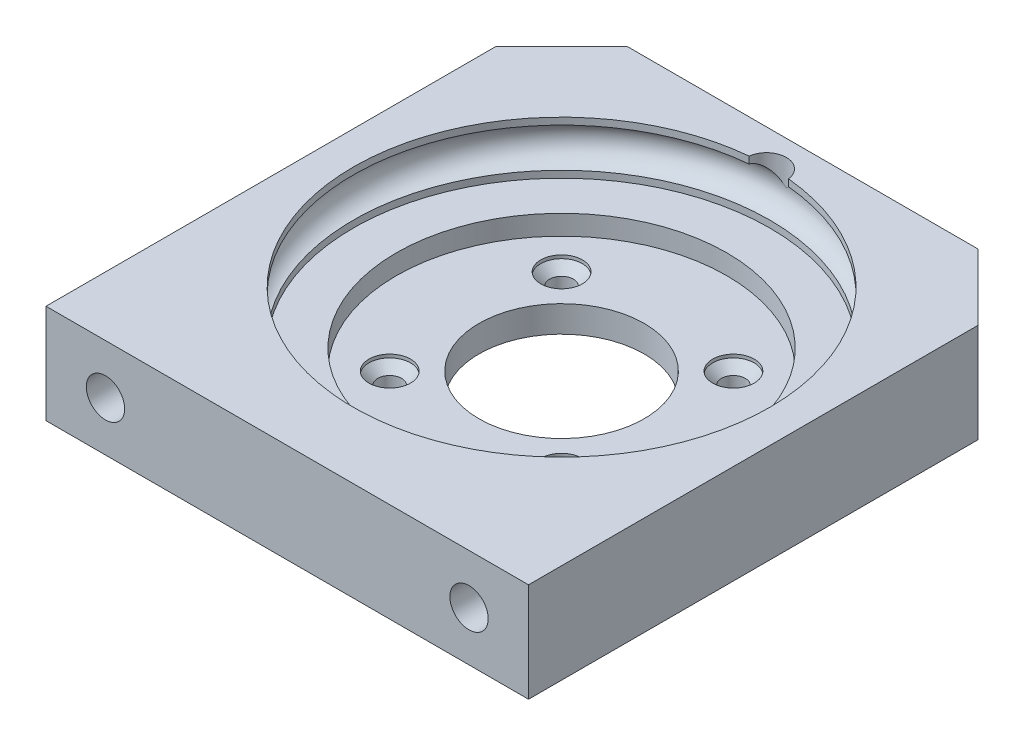
ISO-10303-21;
HEADER;
FILE_DESCRIPTION(('STEP AP214'),'2;1');
FILE_NAME('part.step','',(''),(''),'','','');
FILE_SCHEMA(('AUTOMOTIVE_DESIGN { 1 0 10303 214 1 1 1 1 }'));
ENDSEC;
DATA;
#1=APPLICATION_CONTEXT('core data for automotive mechanical design processes');
#2=APPLICATION_PROTOCOL_DEFINITION('international standard','automotive_design',2000,#1);
#3=PRODUCT_CONTEXT('',#1,'mechanical');
#4=PRODUCT('Part','Part','',(#3));
#5=PRODUCT_RELATED_PRODUCT_CATEGORY('part','',(#4));
#6=PRODUCT_DEFINITION_FORMATION('','',#4);
#7=PRODUCT_DEFINITION_CONTEXT('part definition',#1,'design');
#8=PRODUCT_DEFINITION('design','',#6,#7);
#9=PRODUCT_DEFINITION_SHAPE('','',#8);
#10=(LENGTH_UNIT() NAMED_UNIT(*) SI_UNIT(.MILLI.,.METRE.));
#11=(NAMED_UNIT(*) PLANE_ANGLE_UNIT() SI_UNIT($,.RADIAN.));
#12=(NAMED_UNIT(*) SI_UNIT($,.STERADIAN.) SOLID_ANGLE_UNIT());
#13=UNCERTAINTY_MEASURE_WITH_UNIT(LENGTH_MEASURE(1.E-05),#10,'distance_accuracy_value','');
#14=(GEOMETRIC_REPRESENTATION_CONTEXT(3) GLOBAL_UNCERTAINTY_ASSIGNED_CONTEXT((#13)) GLOBAL_UNIT_ASSIGNED_CONTEXT((#10,
#11,#12)) REPRESENTATION_CONTEXT('',''));
#15=CARTESIAN_POINT('',(0.,0.,0.));
#16=DIRECTION('',(0.,0.,1.));
#17=DIRECTION('',(1.,0.,0.));
#18=AXIS2_PLACEMENT_3D('',#15,#16,#17);
#19=CARTESIAN_POINT('',(0.,0.,0.));
#20=DIRECTION('',(0.,-1.,0.));
#21=DIRECTION('',(0.,0.,-1.));
#22=AXIS2_PLACEMENT_3D('',#19,#20,#21);
#23=CYLINDRICAL_SURFACE('',#22,31.5);
#24=DIRECTION('',(0.,-1.,0.));
#25=VECTOR('',#24,1.);
#26=CARTESIAN_POINT('',(2.97845792794056,12.,-31.3588709677419));
#27=LINE('',#26,#25);
#28=CARTESIAN_POINT('',(2.97845792794056,9.95803989154981,-31.3588709677419));
#29=VERTEX_POINT('',#28);
#30=CARTESIAN_POINT('',(2.97845792794056,11.,-31.3588709677419));
#31=VERTEX_POINT('',#30);
#32=EDGE_CURVE('E84',#29,#31,#27,.F.);
#33=ORIENTED_EDGE('',*,*,#32,.F.);
#34=CARTESIAN_POINT('',(0.,9.95803989154981,0.));
#35=DIRECTION('',(0.,-1.,0.));
#36=DIRECTION('',(0.,0.,-1.));
#37=AXIS2_PLACEMENT_3D('',#34,#35,#36);
#38=CIRCLE('',#37,31.5);
#39=CARTESIAN_POINT('',(-2.97845792794059,9.95803989154985,-31.3588709677417));
#40=VERTEX_POINT('',#39);
#41=EDGE_CURVE('E256',#40,#29,#38,.F.);
#42=ORIENTED_EDGE('',*,*,#41,.F.);
#43=DIRECTION('',(0.,-1.,0.));
#44=VECTOR('',#43,1.);
#45=CARTESIAN_POINT('',(-2.97845792794056,12.,-31.3588709677419));
#46=LINE('',#45,#44);
#47=CARTESIAN_POINT('',(-2.97845792794057,11.,-31.3588709677419));
#48=VERTEX_POINT('',#47);
#49=EDGE_CURVE('E246',#48,#40,#46,.T.);
#50=ORIENTED_EDGE('',*,*,#49,.F.);
#51=CARTESIAN_POINT('',(0.,11.,0.));
#52=DIRECTION('',(0.,-1.,0.));
#53=DIRECTION('',(0.,0.,-1.));
#54=AXIS2_PLACEMENT_3D('',#51,#52,#53);
#55=CIRCLE('',#54,31.5);
#56=EDGE_CURVE('E255',#31,#48,#55,.T.);
#57=ORIENTED_EDGE('',*,*,#56,.F.);
#58=EDGE_LOOP('',(#33,#42,#50,#57));
#59=FACE_BOUND('',#58,.T.);
#60=ADVANCED_FACE('F59',(#59),#23,.F.);
#61=CARTESIAN_POINT('',(0.,7.,0.));
#62=DIRECTION('',(0.,1.,0.));
#63=DIRECTION('',(0.,0.,1.));
#64=AXIS2_PLACEMENT_3D('',#61,#62,#63);
#65=TOROIDAL_SURFACE('',#64,31.,3.);
#66=CARTESIAN_POINT('',(0.,4.04196010845019,0.));
#67=DIRECTION('',(0.,1.,0.));
#68=DIRECTION('',(0.,0.,1.));
#69=AXIS2_PLACEMENT_3D('',#66,#67,#68);
#70=CIRCLE('',#69,31.5);
#71=CARTESIAN_POINT('',(0.,4.04196010845019,31.5));
#72=VERTEX_POINT('',#71);
#73=EDGE_CURVE('E251',#72,#72,#70,.F.);
#74=ORIENTED_EDGE('',*,*,#73,.T.);
#75=EDGE_LOOP('',(#74));
#76=FACE_BOUND('',#75,.T.);
#77=CARTESIAN_POINT('',(2.97860271892137,9.95823989154962,-31.3576672235951));
#78=CARTESIAN_POINT('',(2.96961319538511,9.94580815796942,-31.4326612954091));
#79=CARTESIAN_POINT('',(2.95781984500975,9.93069112648078,-31.5068265589619));
#80=CARTESIAN_POINT('',(2.92904327671696,9.89556756812398,-31.6528469616678));
#81=CARTESIAN_POINT('',(2.91206774191171,9.87556828841667,-31.7247053478591));
#82=CARTESIAN_POINT('',(2.87350186212874,9.83133545555906,-31.8650067964754));
#83=CARTESIAN_POINT('',(2.85195741896618,9.80714442744418,-31.9334760380271));
#84=CARTESIAN_POINT('',(2.80459274499494,9.75486552097224,-32.0673838385704));
#85=CARTESIAN_POINT('',(2.77877097644328,9.72677624174456,-32.132821296738));
#86=CARTESIAN_POINT('',(2.69587281937994,9.63770358228518,-32.3233887363522));
#87=CARTESIAN_POINT('',(2.63309368495355,9.57160690276578,-32.4437205284455));
#88=CARTESIAN_POINT('',(2.49536513058079,9.42883664525896,-32.6705868738374));
#89=CARTESIAN_POINT('',(2.42038123113751,9.35213319739032,-32.7770807546173));
#90=CARTESIAN_POINT('',(2.2186475967732,9.1479449392115,-33.0286994375676));
#91=CARTESIAN_POINT('',(2.08552089026227,9.01508753824053,-33.1643953651653));
#92=CARTESIAN_POINT('',(1.80418814678327,8.73718027948922,-33.4039921001392));
#93=CARTESIAN_POINT('',(1.65594939594703,8.59210409423334,-33.5078218909128));
#94=CARTESIAN_POINT('',(1.30250196492393,8.24845599376992,-33.7123807801422));
#95=CARTESIAN_POINT('',(1.09376903077063,8.04712807205924,-33.8023835834338));
#96=CARTESIAN_POINT('',(0.668072251464688,7.63832921215929,-33.9331125173233));
#97=CARTESIAN_POINT('',(0.451123531311858,7.43086970321803,-33.9739250525231));
#98=CARTESIAN_POINT('',(0.15839588872738,7.15124751721302,-33.9967571002609));
#99=CARTESIAN_POINT('',(0.0833492871382182,7.07958724633899,-33.9997809584472));
#100=CARTESIAN_POINT('',(0.0055314779359947,7.00528180752916,-33.9999961750689));
#101=CARTESIAN_POINT('',(0.00276574036243576,7.00264090508273,-33.9999999996302));
#102=CARTESIAN_POINT('',(0.,7.,-34.));
#103=B_SPLINE_CURVE_WITH_KNOTS('',3,(#77,#78,#79,#80,#81,#82,#83,#84,#85,#86,#87,#88,#89,#90,
#91,#92,#93,#94,#95,#96,#97,#98,#99,#100,#101,#102),.UNSPECIFIED.,.F.,.F.,(4,2,2,2,2,2,2,2,2,2,
2,2,4),(0.,0.229471447735022,0.458604319690245,0.685535884959593,0.912549212260038,
1.36351867841234,1.81578501916203,2.50768630929996,3.20111855163623,4.10731547292602,
5.01191829368785,5.32323496449337,5.33470723693077),.UNSPECIFIED.);
#104=CARTESIAN_POINT('',(0.,7.,-34.));
#105=VERTEX_POINT('',#104);
#106=EDGE_CURVE('E73',#29,#105,#103,.T.);
#107=ORIENTED_EDGE('',*,*,#106,.T.);
#108=CARTESIAN_POINT('',(0.,7.,-34.));
#109=CARTESIAN_POINT('',(-0.002765647860512,7.00264081668702,-34.0000000011512));
#110=CARTESIAN_POINT('',(-0.00553138660048125,7.00528172024243,-33.9999961767244));
#111=CARTESIAN_POINT('',(-0.23464124815582,7.22405052621168,-33.9993624234132));
#112=CARTESIAN_POINT('',(-0.461539385494061,7.44071660879585,-33.973111273688));
#113=CARTESIAN_POINT('',(-0.796409689426835,7.76155236974791,-33.89464314795));
#114=CARTESIAN_POINT('',(-0.907306746938084,7.8679836102798,-33.861881456631));
#115=CARTESIAN_POINT('',(-1.12631166996082,8.07871570513723,-33.7829742681646));
#116=CARTESIAN_POINT('',(-1.23442082309198,8.18301753813848,-33.7368350746216));
#117=CARTESIAN_POINT('',(-1.50062536791018,8.44078143318314,-33.6038737713653));
#118=CARTESIAN_POINT('',(-1.65627960865482,8.59236196190765,-33.5082849273703));
#119=CARTESIAN_POINT('',(-1.95369746867632,8.88442459343492,-33.2842160575573));
#120=CARTESIAN_POINT('',(-2.09548146070192,9.02492291325072,-33.1557853044252));
#121=CARTESIAN_POINT('',(-2.32460934254051,9.25485851140415,-32.9019630596168));
#122=CARTESIAN_POINT('',(-2.41658632367543,9.34814636700671,-32.7842503508661));
#123=CARTESIAN_POINT('',(-2.58505712644061,9.52138642029013,-32.52989565695));
#124=CARTESIAN_POINT('',(-2.66160982974674,9.60138911960184,-32.3933291470279));
#125=CARTESIAN_POINT('',(-2.75881008738837,9.70520608764476,-32.1808565423279));
#126=CARTESIAN_POINT('',(-2.78736085797565,9.73607532256737,-32.1118957326226));
#127=CARTESIAN_POINT('',(-2.83969690867676,9.79348493503032,-31.9704637216388));
#128=CARTESIAN_POINT('',(-2.86348454641178,9.82002745296235,-31.8979942792067));
#129=CARTESIAN_POINT('',(-2.90601536881001,9.86850267568364,-31.7490853466569));
#130=CARTESIAN_POINT('',(-2.92469760738888,9.89037905439563,-31.6726098721228));
#131=CARTESIAN_POINT('',(-2.95619584400745,9.92861274432593,-31.5169666725388));
#132=CARTESIAN_POINT('',(-2.96900092172859,9.94495976678048,-31.4377942270065));
#133=CARTESIAN_POINT('',(-2.97860271892137,9.95823989154963,-31.3576672235951));
#134=B_SPLINE_CURVE_WITH_KNOTS('',3,(#108,#109,#110,#111,#112,#113,#114,#115,#116,#117,#118,
#119,#120,#121,#122,#123,#124,#125,#126,#127,#128,#129,#130,#131,#132,#133),.UNSPECIFIED.,.F.,
.F.,(4,2,2,2,2,2,2,2,2,2,2,2,4),(0.,0.0114722724373894,0.950318295086905,1.42136837522893,
1.89219685189768,2.60169449687052,3.31013386528673,3.83676155840078,4.36133910101925,
4.60337668360134,4.8452941663969,5.08998456815068,5.33512780519066),.UNSPECIFIED.);
#135=EDGE_CURVE('E12',#105,#40,#134,.T.);
#136=ORIENTED_EDGE('',*,*,#135,.T.);
#137=ORIENTED_EDGE('',*,*,#41,.T.);
#138=EDGE_LOOP('',(#107,#136,#137));
#139=FACE_BOUND('',#138,.T.);
#140=ADVANCED_FACE('F278',(#76,#139),#65,.F.);
#141=CARTESIAN_POINT('',(0.,3.,0.));
#142=DIRECTION('',(0.,-1.,0.));
#143=DIRECTION('',(0.,0.,-1.));
#144=AXIS2_PLACEMENT_3D('',#141,#142,#143);
#145=CIRCLE('',#144,31.5);
#146=CARTESIAN_POINT('',(0.,3.,-31.5));
#147=VERTEX_POINT('',#146);
#148=EDGE_CURVE('E252',#147,#147,#145,.T.);
#149=ORIENTED_EDGE('',*,*,#148,.T.);
#150=EDGE_LOOP('',(#149));
#151=FACE_BOUND('',#150,.T.);
#152=ORIENTED_EDGE('',*,*,#73,.F.);
#153=EDGE_LOOP('',(#152));
#154=FACE_BOUND('',#153,.T.);
#155=ADVANCED_FACE('F374',(#151,#154),#23,.F.);
#156=CARTESIAN_POINT('',(-25.,3.,0.));
#157=DIRECTION('',(0.,-1.,0.));
#158=DIRECTION('',(0.,0.,-1.));
#159=AXIS2_PLACEMENT_3D('',#156,#157,#158);
#160=PLANE('',#159);
#161=ORIENTED_EDGE('',*,*,#148,.F.);
#162=EDGE_LOOP('',(#161));
#163=FACE_BOUND('',#162,.T.);
#164=CARTESIAN_POINT('',(0.,3.,0.));
#165=DIRECTION('',(0.,-1.,0.));
#166=DIRECTION('',(0.,0.,-1.));
#167=AXIS2_PLACEMENT_3D('',#164,#165,#166);
#168=CIRCLE('',#167,25.);
#169=CARTESIAN_POINT('',(0.,3.,-25.));
#170=VERTEX_POINT('',#169);
#171=EDGE_CURVE('E268',#170,#170,#168,.T.);
#172=ORIENTED_EDGE('',*,*,#171,.T.);
#173=EDGE_LOOP('',(#172));
#174=FACE_BOUND('',#173,.T.);
#175=ADVANCED_FACE('F61',(#163,#174),#160,.F.);
#176=CARTESIAN_POINT('',(0.,0.,0.));
#177=DIRECTION('',(0.,-1.,0.));
#178=DIRECTION('',(0.,0.,-1.));
#179=AXIS2_PLACEMENT_3D('',#176,#177,#178);
#180=CYLINDRICAL_SURFACE('',#179,25.);
#181=ORIENTED_EDGE('',*,*,#171,.F.);
#182=EDGE_LOOP('',(#181));
#183=FACE_BOUND('',#182,.T.);
#184=CARTESIAN_POINT('',(0.,0.,0.));
#185=DIRECTION('',(0.,-1.,0.));
#186=DIRECTION('',(0.,0.,-1.));
#187=AXIS2_PLACEMENT_3D('',#184,#185,#186);
#188=CIRCLE('',#187,25.);
#189=CARTESIAN_POINT('',(0.,0.,-25.));
#190=VERTEX_POINT('',#189);
#191=EDGE_CURVE('E265',#190,#190,#188,.T.);
#192=ORIENTED_EDGE('',*,*,#191,.T.);
#193=EDGE_LOOP('',(#192));
#194=FACE_BOUND('',#193,.T.);
#195=ADVANCED_FACE('F385',(#183,#194),#180,.F.);
#196=CARTESIAN_POINT('',(-25.,0.,0.));
#197=DIRECTION('',(0.,-1.,0.));
#198=DIRECTION('',(0.,0.,-1.));
#199=AXIS2_PLACEMENT_3D('',#196,#197,#198);
#200=PLANE('',#199);
#201=CARTESIAN_POINT('',(13.,0.,-13.));
#202=DIRECTION('',(0.,1.,0.));
#203=DIRECTION('',(0.,0.,1.));
#204=AXIS2_PLACEMENT_3D('',#201,#202,#203);
#205=CIRCLE('',#204,3.15);
#206=CARTESIAN_POINT('',(13.,0.,-9.85));
#207=VERTEX_POINT('',#206);
#208=EDGE_CURVE('E140',#207,#207,#205,.T.);
#209=ORIENTED_EDGE('',*,*,#208,.F.);
#210=EDGE_LOOP('',(#209));
#211=FACE_BOUND('',#210,.T.);
#212=CARTESIAN_POINT('',(13.,0.,13.));
#213=DIRECTION('',(0.,1.,0.));
#214=DIRECTION('',(0.,0.,1.));
#215=AXIS2_PLACEMENT_3D('',#212,#213,#214);
#216=CIRCLE('',#215,3.15);
#217=CARTESIAN_POINT('',(13.,0.,16.15));
#218=VERTEX_POINT('',#217);
#219=EDGE_CURVE('E180',#218,#218,#216,.T.);
#220=ORIENTED_EDGE('',*,*,#219,.F.);
#221=EDGE_LOOP('',(#220));
#222=FACE_BOUND('',#221,.T.);
#223=CARTESIAN_POINT('',(-13.,0.,13.));
#224=DIRECTION('',(0.,1.,0.));
#225=DIRECTION('',(0.,0.,1.));
#226=AXIS2_PLACEMENT_3D('',#223,#224,#225);
#227=CIRCLE('',#226,3.15);
#228=CARTESIAN_POINT('',(-13.,0.,16.15));
#229=VERTEX_POINT('',#228);
#230=EDGE_CURVE('E192',#229,#229,#227,.T.);
#231=ORIENTED_EDGE('',*,*,#230,.F.);
#232=EDGE_LOOP('',(#231));
#233=FACE_BOUND('',#232,.T.);
#234=CARTESIAN_POINT('',(-13.,0.,-13.));
#235=DIRECTION('',(0.,1.,0.));
#236=DIRECTION('',(0.,0.,1.));
#237=AXIS2_PLACEMENT_3D('',#234,#235,#236);
#238=CIRCLE('',#237,3.15);
#239=CARTESIAN_POINT('',(-13.,0.,-9.85));
#240=VERTEX_POINT('',#239);
#241=EDGE_CURVE('E204',#240,#240,#238,.T.);
#242=ORIENTED_EDGE('',*,*,#241,.F.);
#243=EDGE_LOOP('',(#242));
#244=FACE_BOUND('',#243,.T.);
#245=ORIENTED_EDGE('',*,*,#191,.F.);
#246=EDGE_LOOP('',(#245));
#247=FACE_BOUND('',#246,.T.);
#248=CARTESIAN_POINT('',(0.,0.,0.));
#249=DIRECTION('',(0.,-1.,0.));
#250=DIRECTION('',(0.,0.,-1.));
#251=AXIS2_PLACEMENT_3D('',#248,#249,#250);
#252=CIRCLE('',#251,12.5);
#253=CARTESIAN_POINT('',(0.,0.,-12.5));
#254=VERTEX_POINT('',#253);
#255=EDGE_CURVE('E262',#254,#254,#252,.T.);
#256=ORIENTED_EDGE('',*,*,#255,.T.);
#257=EDGE_LOOP('',(#256));
#258=FACE_BOUND('',#257,.T.);
#259=ADVANCED_FACE('F415',(#211,#222,#233,#244,#247,#258),#200,.F.);
#260=CARTESIAN_POINT('',(0.,0.,0.));
#261=DIRECTION('',(0.,-1.,0.));
#262=DIRECTION('',(0.,0.,-1.));
#263=AXIS2_PLACEMENT_3D('',#260,#261,#262);
#264=CYLINDRICAL_SURFACE('',#263,12.5);
#265=ORIENTED_EDGE('',*,*,#255,.F.);
#266=EDGE_LOOP('',(#265));
#267=FACE_BOUND('',#266,.T.);
#268=CARTESIAN_POINT('',(0.,-4.,0.));
#269=DIRECTION('',(0.,-1.,0.));
#270=DIRECTION('',(0.,0.,-1.));
#271=AXIS2_PLACEMENT_3D('',#268,#269,#270);
#272=CIRCLE('',#271,12.5);
#273=CARTESIAN_POINT('',(0.,-4.,-12.5));
#274=VERTEX_POINT('',#273);
#275=EDGE_CURVE('E259',#274,#274,#272,.T.);
#276=ORIENTED_EDGE('',*,*,#275,.T.);
#277=EDGE_LOOP('',(#276));
#278=FACE_BOUND('',#277,.T.);
#279=ADVANCED_FACE('F409',(#267,#278),#264,.F.);
#280=CARTESIAN_POINT('',(-12.5,-4.,0.));
#281=DIRECTION('',(0.,1.,0.));
#282=DIRECTION('',(0.,0.,1.));
#283=AXIS2_PLACEMENT_3D('',#280,#281,#282);
#284=PLANE('',#283);
#285=CARTESIAN_POINT('',(13.,-4.,-13.));
#286=DIRECTION('',(0.,1.,0.));
#287=DIRECTION('',(0.,0.,1.));
#288=AXIS2_PLACEMENT_3D('',#285,#286,#287);
#289=CIRCLE('',#288,1.8);
#290=CARTESIAN_POINT('',(13.,-4.,-11.2));
#291=VERTEX_POINT('',#290);
#292=EDGE_CURVE('E177',#291,#291,#289,.T.);
#293=ORIENTED_EDGE('',*,*,#292,.T.);
#294=EDGE_LOOP('',(#293));
#295=FACE_BOUND('',#294,.T.);
#296=CARTESIAN_POINT('',(13.,-4.,13.));
#297=DIRECTION('',(0.,1.,0.));
#298=DIRECTION('',(0.,0.,1.));
#299=AXIS2_PLACEMENT_3D('',#296,#297,#298);
#300=CIRCLE('',#299,1.8);
#301=CARTESIAN_POINT('',(13.,-4.,14.8));
#302=VERTEX_POINT('',#301);
#303=EDGE_CURVE('E189',#302,#302,#300,.T.);
#304=ORIENTED_EDGE('',*,*,#303,.T.);
#305=EDGE_LOOP('',(#304));
#306=FACE_BOUND('',#305,.T.);
#307=CARTESIAN_POINT('',(-13.,-4.,13.));
#308=DIRECTION('',(0.,1.,0.));
#309=DIRECTION('',(0.,0.,1.));
#310=AXIS2_PLACEMENT_3D('',#307,#308,#309);
#311=CIRCLE('',#310,1.8);
#312=CARTESIAN_POINT('',(-13.,-4.,14.8));
#313=VERTEX_POINT('',#312);
#314=EDGE_CURVE('E201',#313,#313,#311,.T.);
#315=ORIENTED_EDGE('',*,*,#314,.T.);
#316=EDGE_LOOP('',(#315));
#317=FACE_BOUND('',#316,.T.);
#318=CARTESIAN_POINT('',(-13.,-4.,-13.));
#319=DIRECTION('',(0.,1.,0.));
#320=DIRECTION('',(0.,0.,1.));
#321=AXIS2_PLACEMENT_3D('',#318,#319,#320);
#322=CIRCLE('',#321,1.8);
#323=CARTESIAN_POINT('',(-13.,-4.,-11.2));
#324=VERTEX_POINT('',#323);
#325=EDGE_CURVE('E213',#324,#324,#322,.T.);
#326=ORIENTED_EDGE('',*,*,#325,.T.);
#327=EDGE_LOOP('',(#326));
#328=FACE_BOUND('',#327,.T.);
#329=ORIENTED_EDGE('',*,*,#275,.F.);
#330=EDGE_LOOP('',(#329));
#331=FACE_BOUND('',#330,.T.);
#332=DIRECTION('',(0.,0.,-1.));
#333=VECTOR('',#332,1.);
#334=CARTESIAN_POINT('',(-36.5,-4.,0.));
#335=LINE('',#334,#333);
#336=CARTESIAN_POINT('',(-36.5,-4.,41.5));
#337=VERTEX_POINT('',#336);
#338=CARTESIAN_POINT('',(-36.5,-4.,-26.5));
#339=VERTEX_POINT('',#338);
#340=EDGE_CURVE('E234',#337,#339,#335,.T.);
#341=ORIENTED_EDGE('',*,*,#340,.T.);
#342=DIRECTION('',(-0.707106781186549,0.,0.707106781186546));
#343=VECTOR('',#342,1.);
#344=CARTESIAN_POINT('',(-31.4999999999999,-4.,-31.5));
#345=LINE('',#344,#343);
#346=CARTESIAN_POINT('',(-26.5,-4.,-36.5));
#347=VERTEX_POINT('',#346);
#348=EDGE_CURVE('E136',#347,#339,#345,.T.);
#349=ORIENTED_EDGE('',*,*,#348,.F.);
#350=DIRECTION('',(-1.,0.,0.));
#351=VECTOR('',#350,1.);
#352=CARTESIAN_POINT('',(0.,-4.,-36.5));
#353=LINE('',#352,#351);
#354=CARTESIAN_POINT('',(26.4999999999999,-4.,-36.5));
#355=VERTEX_POINT('',#354);
#356=EDGE_CURVE('E130',#355,#347,#353,.T.);
#357=ORIENTED_EDGE('',*,*,#356,.F.);
#358=DIRECTION('',(0.707106781186549,0.,0.707106781186546));
#359=VECTOR('',#358,1.);
#360=CARTESIAN_POINT('',(31.4999999999999,-4.,-31.5000000000001));
#361=LINE('',#360,#359);
#362=CARTESIAN_POINT('',(36.5,-4.,-26.5));
#363=VERTEX_POINT('',#362);
#364=EDGE_CURVE('E133',#355,#363,#361,.T.);
#365=ORIENTED_EDGE('',*,*,#364,.T.);
#366=DIRECTION('',(0.,0.,1.));
#367=VECTOR('',#366,1.);
#368=CARTESIAN_POINT('',(36.5,-4.,41.5));
#369=LINE('',#368,#367);
#370=CARTESIAN_POINT('',(36.5,-4.,41.5));
#371=VERTEX_POINT('',#370);
#372=EDGE_CURVE('E231',#363,#371,#369,.T.);
#373=ORIENTED_EDGE('',*,*,#372,.T.);
#374=DIRECTION('',(-1.,0.,0.));
#375=VECTOR('',#374,1.);
#376=CARTESIAN_POINT('',(-36.5,-4.,41.5));
#377=LINE('',#376,#375);
#378=EDGE_CURVE('E229',#371,#337,#377,.T.);
#379=ORIENTED_EDGE('',*,*,#378,.T.);
#380=EDGE_LOOP('',(#341,#349,#357,#365,#373,#379));
#381=FACE_BOUND('',#380,.T.);
#382=ADVANCED_FACE('F132',(#295,#306,#317,#328,#331,#381),#284,.F.);
#383=CARTESIAN_POINT('',(-31.5,11.,0.));
#384=DIRECTION('',(0.,-1.,0.));
#385=DIRECTION('',(0.,0.,-1.));
#386=AXIS2_PLACEMENT_3D('',#383,#384,#385);
#387=PLANE('',#386);
#388=CARTESIAN_POINT('',(0.,11.,-31.));
#389=DIRECTION('',(0.,-1.,0.));
#390=DIRECTION('',(0.,0.,-1.));
#391=AXIS2_PLACEMENT_3D('',#388,#389,#390);
#392=CIRCLE('',#391,3.);
#393=EDGE_CURVE('E249',#31,#48,#392,.F.);
#394=ORIENTED_EDGE('',*,*,#393,.F.);
#395=ORIENTED_EDGE('',*,*,#56,.T.);
#396=EDGE_LOOP('',(#394,#395));
#397=FACE_BOUND('',#396,.T.);
#398=DIRECTION('',(0.,0.,-1.));
#399=VECTOR('',#398,1.);
#400=CARTESIAN_POINT('',(36.5,11.,41.5));
#401=LINE('',#400,#399);
#402=CARTESIAN_POINT('',(36.5,11.,41.5));
#403=VERTEX_POINT('',#402);
#404=CARTESIAN_POINT('',(36.5,11.,-26.5));
#405=VERTEX_POINT('',#404);
#406=EDGE_CURVE('E240',#403,#405,#401,.T.);
#407=ORIENTED_EDGE('',*,*,#406,.T.);
#408=DIRECTION('',(-0.707106781186549,0.,-0.707106781186546));
#409=VECTOR('',#408,1.);
#410=CARTESIAN_POINT('',(31.4999999999999,11.,-31.5000000000001));
#411=LINE('',#410,#409);
#412=CARTESIAN_POINT('',(26.4999999999999,11.,-36.5));
#413=VERTEX_POINT('',#412);
#414=EDGE_CURVE('E151',#405,#413,#411,.T.);
#415=ORIENTED_EDGE('',*,*,#414,.T.);
#416=DIRECTION('',(1.,0.,0.));
#417=VECTOR('',#416,1.);
#418=CARTESIAN_POINT('',(0.,11.,-36.5));
#419=LINE('',#418,#417);
#420=CARTESIAN_POINT('',(-26.5,11.,-36.5));
#421=VERTEX_POINT('',#420);
#422=EDGE_CURVE('E150',#421,#413,#419,.T.);
#423=ORIENTED_EDGE('',*,*,#422,.F.);
#424=DIRECTION('',(0.707106781186549,0.,-0.707106781186546));
#425=VECTOR('',#424,1.);
#426=CARTESIAN_POINT('',(-31.4999999999999,11.,-31.5));
#427=LINE('',#426,#425);
#428=CARTESIAN_POINT('',(-36.5,11.,-26.5));
#429=VERTEX_POINT('',#428);
#430=EDGE_CURVE('E160',#429,#421,#427,.T.);
#431=ORIENTED_EDGE('',*,*,#430,.F.);
#432=DIRECTION('',(0.,0.,1.));
#433=VECTOR('',#432,1.);
#434=CARTESIAN_POINT('',(-36.5,11.,0.));
#435=LINE('',#434,#433);
#436=CARTESIAN_POINT('',(-36.5,11.,41.5));
#437=VERTEX_POINT('',#436);
#438=EDGE_CURVE('E220',#429,#437,#435,.T.);
#439=ORIENTED_EDGE('',*,*,#438,.T.);
#440=DIRECTION('',(1.,0.,0.));
#441=VECTOR('',#440,1.);
#442=CARTESIAN_POINT('',(-36.5,11.,41.5));
#443=LINE('',#442,#441);
#444=EDGE_CURVE('E237',#437,#403,#443,.T.);
#445=ORIENTED_EDGE('',*,*,#444,.T.);
#446=EDGE_LOOP('',(#407,#415,#423,#431,#439,#445));
#447=FACE_BOUND('',#446,.T.);
#448=ADVANCED_FACE('F286',(#397,#447),#387,.F.);
#449=CARTESIAN_POINT('',(0.,17.,-31.));
#450=DIRECTION('',(0.,-1.,0.));
#451=DIRECTION('',(0.,0.,-1.));
#452=AXIS2_PLACEMENT_3D('',#449,#450,#451);
#453=CYLINDRICAL_SURFACE('',#452,3.);
#454=ORIENTED_EDGE('',*,*,#393,.T.);
#455=ORIENTED_EDGE('',*,*,#49,.T.);
#456=ORIENTED_EDGE('',*,*,#135,.F.);
#457=ORIENTED_EDGE('',*,*,#106,.F.);
#458=ORIENTED_EDGE('',*,*,#32,.T.);
#459=EDGE_LOOP('',(#454,#455,#456,#457,#458));
#460=FACE_BOUND('',#459,.T.);
#461=ADVANCED_FACE('F281',(#460),#453,.F.);
#462=CARTESIAN_POINT('',(36.5,-87.9717214304911,41.5));
#463=DIRECTION('',(1.,0.,0.));
#464=DIRECTION('',(0.,0.,-1.));
#465=AXIS2_PLACEMENT_3D('',#462,#463,#464);
#466=PLANE('',#465);
#467=ORIENTED_EDGE('',*,*,#372,.F.);
#468=DIRECTION('',(0.,1.,0.));
#469=VECTOR('',#468,1.);
#470=CARTESIAN_POINT('',(36.5,-55.618795026618,-26.5));
#471=LINE('',#470,#469);
#472=EDGE_CURVE('E149',#363,#405,#471,.T.);
#473=ORIENTED_EDGE('',*,*,#472,.T.);
#474=ORIENTED_EDGE('',*,*,#406,.F.);
#475=DIRECTION('',(0.,1.,0.));
#476=VECTOR('',#475,1.);
#477=CARTESIAN_POINT('',(36.5,-87.9717214304911,41.5));
#478=LINE('',#477,#476);
#479=EDGE_CURVE('E232',#371,#403,#478,.T.);
#480=ORIENTED_EDGE('',*,*,#479,.F.);
#481=EDGE_LOOP('',(#467,#473,#474,#480));
#482=FACE_BOUND('',#481,.T.);
#483=ADVANCED_FACE('F285',(#482),#466,.T.);
#484=CARTESIAN_POINT('',(-36.5,-87.9717214304911,41.5));
#485=DIRECTION('',(0.,0.,1.));
#486=DIRECTION('',(1.,0.,0.));
#487=AXIS2_PLACEMENT_3D('',#484,#485,#486);
#488=PLANE('',#487);
#489=CARTESIAN_POINT('',(-27.5,3.5,41.5));
#490=DIRECTION('',(0.,0.,1.));
#491=DIRECTION('',(1.,0.,0.));
#492=AXIS2_PLACEMENT_3D('',#489,#490,#491);
#493=CIRCLE('',#492,2.9);
#494=CARTESIAN_POINT('',(-24.6,3.5,41.5));
#495=VERTEX_POINT('',#494);
#496=EDGE_CURVE('E221',#495,#495,#493,.T.);
#497=ORIENTED_EDGE('',*,*,#496,.F.);
#498=EDGE_LOOP('',(#497));
#499=FACE_BOUND('',#498,.T.);
#500=CARTESIAN_POINT('',(27.5,3.5,41.5));
#501=DIRECTION('',(0.,0.,1.));
#502=DIRECTION('',(-1.,0.,0.));
#503=AXIS2_PLACEMENT_3D('',#500,#501,#502);
#504=CIRCLE('',#503,2.9);
#505=CARTESIAN_POINT('',(30.4,3.5,41.5));
#506=VERTEX_POINT('',#505);
#507=EDGE_CURVE('E216',#506,#506,#504,.T.);
#508=ORIENTED_EDGE('',*,*,#507,.F.);
#509=EDGE_LOOP('',(#508));
#510=FACE_BOUND('',#509,.T.);
#511=ORIENTED_EDGE('',*,*,#378,.F.);
#512=ORIENTED_EDGE('',*,*,#479,.T.);
#513=ORIENTED_EDGE('',*,*,#444,.F.);
#514=DIRECTION('',(0.,1.,0.));
#515=VECTOR('',#514,1.);
#516=CARTESIAN_POINT('',(-36.5,-87.9717214304911,41.5));
#517=LINE('',#516,#515);
#518=EDGE_CURVE('E242',#337,#437,#517,.T.);
#519=ORIENTED_EDGE('',*,*,#518,.F.);
#520=EDGE_LOOP('',(#511,#512,#513,#519));
#521=FACE_BOUND('',#520,.T.);
#522=ADVANCED_FACE('F292',(#499,#510,#521),#488,.T.);
#523=CARTESIAN_POINT('',(-36.5,-87.9717214304911,0.));
#524=DIRECTION('',(-1.,0.,0.));
#525=DIRECTION('',(0.,0.,1.));
#526=AXIS2_PLACEMENT_3D('',#523,#524,#525);
#527=PLANE('',#526);
#528=ORIENTED_EDGE('',*,*,#340,.F.);
#529=ORIENTED_EDGE('',*,*,#518,.T.);
#530=ORIENTED_EDGE('',*,*,#438,.F.);
#531=DIRECTION('',(0.,1.,0.));
#532=VECTOR('',#531,1.);
#533=CARTESIAN_POINT('',(-36.5,-55.618795026618,-26.5));
#534=LINE('',#533,#532);
#535=EDGE_CURVE('E164',#339,#429,#534,.T.);
#536=ORIENTED_EDGE('',*,*,#535,.F.);
#537=EDGE_LOOP('',(#528,#529,#530,#536));
#538=FACE_BOUND('',#537,.T.);
#539=ADVANCED_FACE('F287',(#538),#527,.T.);
#540=CARTESIAN_POINT('',(27.5,3.5,35.));
#541=DIRECTION('',(0.,0.,1.));
#542=DIRECTION('',(1.,0.,0.));
#543=AXIS2_PLACEMENT_3D('',#540,#541,#542);
#544=CYLINDRICAL_SURFACE('',#543,2.9);
#545=CARTESIAN_POINT('',(27.5,3.5,35.));
#546=DIRECTION('',(0.,0.,1.));
#547=DIRECTION('',(-1.,0.,0.));
#548=AXIS2_PLACEMENT_3D('',#545,#546,#547);
#549=CIRCLE('',#548,2.9);
#550=CARTESIAN_POINT('',(30.4,3.5,35.));
#551=VERTEX_POINT('',#550);
#552=EDGE_CURVE('E224',#551,#551,#549,.T.);
#553=CARTESIAN_POINT('',(30.4,3.5,35.));
#554=CARTESIAN_POINT('',(30.4,3.5,35.0677083333333));
#555=CARTESIAN_POINT('',(30.4,3.5,35.1354166666667));
#556=CARTESIAN_POINT('',(30.4,3.5,35.2708333333333));
#557=CARTESIAN_POINT('',(30.4,3.5,35.3385416666667));
#558=CARTESIAN_POINT('',(30.4,3.5,35.4739583333333));
#559=CARTESIAN_POINT('',(30.4,3.5,35.5416666666667));
#560=CARTESIAN_POINT('',(30.4,3.5,35.6770833333333));
#561=CARTESIAN_POINT('',(30.4,3.5,35.7447916666667));
#562=CARTESIAN_POINT('',(30.4,3.5,35.8802083333333));
#563=CARTESIAN_POINT('',(30.4,3.5,35.9479166666667));
#564=CARTESIAN_POINT('',(30.4,3.5,36.0833333333333));
#565=CARTESIAN_POINT('',(30.4,3.5,36.1510416666667));
#566=CARTESIAN_POINT('',(30.4,3.5,36.2864583333333));
#567=CARTESIAN_POINT('',(30.4,3.5,36.3541666666667));
#568=CARTESIAN_POINT('',(30.4,3.5,36.4895833333333));
#569=CARTESIAN_POINT('',(30.4,3.5,36.5572916666667));
#570=CARTESIAN_POINT('',(30.4,3.5,36.6927083333333));
#571=CARTESIAN_POINT('',(30.4,3.5,36.7604166666667));
#572=CARTESIAN_POINT('',(30.4,3.5,36.8958333333333));
#573=CARTESIAN_POINT('',(30.4,3.5,36.9635416666667));
#574=CARTESIAN_POINT('',(30.4,3.5,37.0989583333333));
#575=CARTESIAN_POINT('',(30.4,3.5,37.1666666666667));
#576=CARTESIAN_POINT('',(30.4,3.5,37.3020833333333));
#577=CARTESIAN_POINT('',(30.4,3.5,37.3697916666667));
#578=CARTESIAN_POINT('',(30.4,3.5,37.5052083333333));
#579=CARTESIAN_POINT('',(30.4,3.5,37.5729166666667));
#580=CARTESIAN_POINT('',(30.4,3.5,37.7083333333333));
#581=CARTESIAN_POINT('',(30.4,3.5,37.7760416666667));
#582=CARTESIAN_POINT('',(30.4,3.5,37.9114583333333));
#583=CARTESIAN_POINT('',(30.4,3.5,37.9791666666667));
#584=CARTESIAN_POINT('',(30.4,3.5,38.1145833333333));
#585=CARTESIAN_POINT('',(30.4,3.5,38.1822916666667));
#586=CARTESIAN_POINT('',(30.4,3.5,38.3177083333333));
#587=CARTESIAN_POINT('',(30.4,3.5,38.3854166666667));
#588=CARTESIAN_POINT('',(30.4,3.5,38.5208333333333));
#589=CARTESIAN_POINT('',(30.4,3.5,38.5885416666667));
#590=CARTESIAN_POINT('',(30.4,3.5,38.7239583333333));
#591=CARTESIAN_POINT('',(30.4,3.5,38.7916666666667));
#592=CARTESIAN_POINT('',(30.4,3.5,38.9270833333333));
#593=CARTESIAN_POINT('',(30.4,3.5,38.9947916666667));
#594=CARTESIAN_POINT('',(30.4,3.5,39.1302083333333));
#595=CARTESIAN_POINT('',(30.4,3.5,39.1979166666667));
#596=CARTESIAN_POINT('',(30.4,3.5,39.3333333333333));
#597=CARTESIAN_POINT('',(30.4,3.5,39.4010416666667));
#598=CARTESIAN_POINT('',(30.4,3.5,39.5364583333333));
#599=CARTESIAN_POINT('',(30.4,3.5,39.6041666666667));
#600=CARTESIAN_POINT('',(30.4,3.5,39.7395833333333));
#601=CARTESIAN_POINT('',(30.4,3.5,39.8072916666667));
#602=CARTESIAN_POINT('',(30.4,3.5,39.9427083333333));
#603=CARTESIAN_POINT('',(30.4,3.5,40.0104166666667));
#604=CARTESIAN_POINT('',(30.4,3.5,40.1458333333333));
#605=CARTESIAN_POINT('',(30.4,3.5,40.2135416666667));
#606=CARTESIAN_POINT('',(30.4,3.5,40.3489583333333));
#607=CARTESIAN_POINT('',(30.4,3.5,40.4166666666667));
#608=CARTESIAN_POINT('',(30.4,3.5,40.5520833333333));
#609=CARTESIAN_POINT('',(30.4,3.5,40.6197916666667));
#610=CARTESIAN_POINT('',(30.4,3.5,40.7552083333333));
#611=CARTESIAN_POINT('',(30.4,3.5,40.8229166666667));
#612=CARTESIAN_POINT('',(30.4,3.5,40.9583333333333));
#613=CARTESIAN_POINT('',(30.4,3.5,41.0260416666667));
#614=CARTESIAN_POINT('',(30.4,3.5,41.1614583333333));
#615=CARTESIAN_POINT('',(30.4,3.5,41.2291666666667));
#616=CARTESIAN_POINT('',(30.4,3.5,41.3645833333333));
#617=CARTESIAN_POINT('',(30.4,3.5,41.4322916666667));
#618=CARTESIAN_POINT('',(30.4,3.5,41.5));
#619=B_SPLINE_CURVE_WITH_KNOTS('',3,(#553,#554,#555,#556,#557,#558,#559,#560,#561,#562,#563,
#564,#565,#566,#567,#568,#569,#570,#571,#572,#573,#574,#575,#576,#577,#578,#579,#580,#581,#582,
#583,#584,#585,#586,#587,#588,#589,#590,#591,#592,#593,#594,#595,#596,#597,#598,#599,#600,#601,
#602,#603,#604,#605,#606,#607,#608,#609,#610,#611,#612,#613,#614,#615,#616,#617,#618),
.UNSPECIFIED.,.F.,.F.,(4,2,2,2,2,2,2,2,2,2,2,2,2,2,2,2,2,2,2,2,2,2,2,2,2,2,2,2,2,2,2,2,4),(0.,
0.203124999999998,0.406249999999997,0.609374999999995,0.812499999999994,1.015625,1.21875,
1.421875,1.62499999999999,1.82812499999999,2.03125,2.234375,2.4375,2.64062499999999,2.84375,
3.046875,3.25,3.45312499999999,3.65624999999999,3.859375,4.0625,4.26562499999999,
4.46874999999999,4.67187499999999,4.875,5.078125,5.28124999999999,5.48437499999999,
5.68749999999999,5.890625,6.09374999999999,6.29687499999999,6.49999999999999),.UNSPECIFIED.);
#620=EDGE_CURVE('BSEAM291',#551,#506,#619,.T.);
#621=ORIENTED_EDGE('',*,*,#552,.F.);
#622=ORIENTED_EDGE('',*,*,#507,.T.);
#623=ORIENTED_EDGE('',*,*,#620,.T.);
#624=ORIENTED_EDGE('',*,*,#620,.F.);
#625=EDGE_LOOP('',(#621,#623,#622,#624));
#626=FACE_BOUND('',#625,.T.);
#627=ADVANCED_FACE('F291',(#626),#544,.F.);
#628=CARTESIAN_POINT('',(27.5,3.5,35.));
#629=DIRECTION('',(0.,0.,-1.));
#630=DIRECTION('',(-1.,0.,0.));
#631=AXIS2_PLACEMENT_3D('',#628,#629,#630);
#632=PLANE('',#631);
#633=ORIENTED_EDGE('',*,*,#552,.T.);
#634=EDGE_LOOP('',(#633));
#635=FACE_BOUND('',#634,.T.);
#636=ADVANCED_FACE('F302',(#635),#632,.F.);
#637=CARTESIAN_POINT('',(-27.5,3.5,35.));
#638=DIRECTION('',(0.,0.,1.));
#639=DIRECTION('',(1.,0.,0.));
#640=AXIS2_PLACEMENT_3D('',#637,#638,#639);
#641=CYLINDRICAL_SURFACE('',#640,2.9);
#642=CARTESIAN_POINT('',(-27.5,3.5,35.));
#643=DIRECTION('',(0.,0.,1.));
#644=DIRECTION('',(1.,0.,0.));
#645=AXIS2_PLACEMENT_3D('',#642,#643,#644);
#646=CIRCLE('',#645,2.9);
#647=CARTESIAN_POINT('',(-24.6,3.5,35.));
#648=VERTEX_POINT('',#647);
#649=EDGE_CURVE('E217',#648,#648,#646,.T.);
#650=CARTESIAN_POINT('',(-24.6,3.5,35.));
#651=CARTESIAN_POINT('',(-24.6,3.5,35.0677083333333));
#652=CARTESIAN_POINT('',(-24.6,3.5,35.1354166666667));
#653=CARTESIAN_POINT('',(-24.6,3.5,35.2708333333333));
#654=CARTESIAN_POINT('',(-24.6,3.5,35.3385416666667));
#655=CARTESIAN_POINT('',(-24.6,3.5,35.4739583333333));
#656=CARTESIAN_POINT('',(-24.6,3.5,35.5416666666667));
#657=CARTESIAN_POINT('',(-24.6,3.5,35.6770833333333));
#658=CARTESIAN_POINT('',(-24.6,3.5,35.7447916666667));
#659=CARTESIAN_POINT('',(-24.6,3.5,35.8802083333333));
#660=CARTESIAN_POINT('',(-24.6,3.5,35.9479166666667));
#661=CARTESIAN_POINT('',(-24.6,3.5,36.0833333333333));
#662=CARTESIAN_POINT('',(-24.6,3.5,36.1510416666667));
#663=CARTESIAN_POINT('',(-24.6,3.5,36.2864583333333));
#664=CARTESIAN_POINT('',(-24.6,3.5,36.3541666666667));
#665=CARTESIAN_POINT('',(-24.6,3.5,36.4895833333333));
#666=CARTESIAN_POINT('',(-24.6,3.5,36.5572916666667));
#667=CARTESIAN_POINT('',(-24.6,3.5,36.6927083333333));
#668=CARTESIAN_POINT('',(-24.6,3.5,36.7604166666667));
#669=CARTESIAN_POINT('',(-24.6,3.5,36.8958333333333));
#670=CARTESIAN_POINT('',(-24.6,3.5,36.9635416666667));
#671=CARTESIAN_POINT('',(-24.6,3.5,37.0989583333333));
#672=CARTESIAN_POINT('',(-24.6,3.5,37.1666666666667));
#673=CARTESIAN_POINT('',(-24.6,3.5,37.3020833333333));
#674=CARTESIAN_POINT('',(-24.6,3.5,37.3697916666667));
#675=CARTESIAN_POINT('',(-24.6,3.5,37.5052083333333));
#676=CARTESIAN_POINT('',(-24.6,3.5,37.5729166666667));
#677=CARTESIAN_POINT('',(-24.6,3.5,37.7083333333333));
#678=CARTESIAN_POINT('',(-24.6,3.5,37.7760416666667));
#679=CARTESIAN_POINT('',(-24.6,3.5,37.9114583333333));
#680=CARTESIAN_POINT('',(-24.6,3.5,37.9791666666667));
#681=CARTESIAN_POINT('',(-24.6,3.5,38.1145833333333));
#682=CARTESIAN_POINT('',(-24.6,3.5,38.1822916666667));
#683=CARTESIAN_POINT('',(-24.6,3.5,38.3177083333333));
#684=CARTESIAN_POINT('',(-24.6,3.5,38.3854166666667));
#685=CARTESIAN_POINT('',(-24.6,3.5,38.5208333333333));
#686=CARTESIAN_POINT('',(-24.6,3.5,38.5885416666667));
#687=CARTESIAN_POINT('',(-24.6,3.5,38.7239583333333));
#688=CARTESIAN_POINT('',(-24.6,3.5,38.7916666666667));
#689=CARTESIAN_POINT('',(-24.6,3.5,38.9270833333333));
#690=CARTESIAN_POINT('',(-24.6,3.5,38.9947916666667));
#691=CARTESIAN_POINT('',(-24.6,3.5,39.1302083333333));
#692=CARTESIAN_POINT('',(-24.6,3.5,39.1979166666667));
#693=CARTESIAN_POINT('',(-24.6,3.5,39.3333333333333));
#694=CARTESIAN_POINT('',(-24.6,3.5,39.4010416666667));
#695=CARTESIAN_POINT('',(-24.6,3.5,39.5364583333333));
#696=CARTESIAN_POINT('',(-24.6,3.5,39.6041666666667));
#697=CARTESIAN_POINT('',(-24.6,3.5,39.7395833333333));
#698=CARTESIAN_POINT('',(-24.6,3.5,39.8072916666667));
#699=CARTESIAN_POINT('',(-24.6,3.5,39.9427083333333));
#700=CARTESIAN_POINT('',(-24.6,3.5,40.0104166666667));
#701=CARTESIAN_POINT('',(-24.6,3.5,40.1458333333333));
#702=CARTESIAN_POINT('',(-24.6,3.5,40.2135416666667));
#703=CARTESIAN_POINT('',(-24.6,3.5,40.3489583333333));
#704=CARTESIAN_POINT('',(-24.6,3.5,40.4166666666667));
#705=CARTESIAN_POINT('',(-24.6,3.5,40.5520833333333));
#706=CARTESIAN_POINT('',(-24.6,3.5,40.6197916666667));
#707=CARTESIAN_POINT('',(-24.6,3.5,40.7552083333333));
#708=CARTESIAN_POINT('',(-24.6,3.5,40.8229166666667));
#709=CARTESIAN_POINT('',(-24.6,3.5,40.9583333333333));
#710=CARTESIAN_POINT('',(-24.6,3.5,41.0260416666667));
#711=CARTESIAN_POINT('',(-24.6,3.5,41.1614583333333));
#712=CARTESIAN_POINT('',(-24.6,3.5,41.2291666666667));
#713=CARTESIAN_POINT('',(-24.6,3.5,41.3645833333333));
#714=CARTESIAN_POINT('',(-24.6,3.5,41.4322916666667));
#715=CARTESIAN_POINT('',(-24.6,3.5,41.5));
#716=B_SPLINE_CURVE_WITH_KNOTS('',3,(#650,#651,#652,#653,#654,#655,#656,#657,#658,#659,#660,
#661,#662,#663,#664,#665,#666,#667,#668,#669,#670,#671,#672,#673,#674,#675,#676,#677,#678,#679,
#680,#681,#682,#683,#684,#685,#686,#687,#688,#689,#690,#691,#692,#693,#694,#695,#696,#697,#698,
#699,#700,#701,#702,#703,#704,#705,#706,#707,#708,#709,#710,#711,#712,#713,#714,#715),
.UNSPECIFIED.,.F.,.F.,(4,2,2,2,2,2,2,2,2,2,2,2,2,2,2,2,2,2,2,2,2,2,2,2,2,2,2,2,2,2,2,2,4),(0.,
0.203124999999998,0.406249999999997,0.609374999999995,0.812499999999994,1.015625,1.21875,
1.421875,1.62499999999999,1.82812499999999,2.03125,2.234375,2.4375,2.64062499999999,2.84375,
3.046875,3.25,3.45312499999999,3.65624999999999,3.859375,4.0625,4.26562499999999,
4.46874999999999,4.67187499999999,4.875,5.078125,5.28124999999999,5.48437499999999,
5.68749999999999,5.890625,6.09374999999999,6.29687499999999,6.49999999999999),.UNSPECIFIED.);
#717=EDGE_CURVE('BSEAM306',#648,#495,#716,.T.);
#718=ORIENTED_EDGE('',*,*,#649,.F.);
#719=ORIENTED_EDGE('',*,*,#496,.T.);
#720=ORIENTED_EDGE('',*,*,#717,.T.);
#721=ORIENTED_EDGE('',*,*,#717,.F.);
#722=EDGE_LOOP('',(#718,#720,#719,#721));
#723=FACE_BOUND('',#722,.T.);
#724=ADVANCED_FACE('F306',(#723),#641,.F.);
#725=CARTESIAN_POINT('',(-27.5,3.5,35.));
#726=DIRECTION('',(0.,0.,1.));
#727=DIRECTION('',(1.,0.,0.));
#728=AXIS2_PLACEMENT_3D('',#725,#726,#727);
#729=PLANE('',#728);
#730=ORIENTED_EDGE('',*,*,#649,.T.);
#731=EDGE_LOOP('',(#730));
#732=FACE_BOUND('',#731,.T.);
#733=ADVANCED_FACE('F310',(#732),#729,.T.);
#734=CARTESIAN_POINT('',(-13.,0.,-13.));
#735=DIRECTION('',(0.,1.,0.));
#736=DIRECTION('',(0.,0.,1.));
#737=AXIS2_PLACEMENT_3D('',#734,#735,#736);
#738=CYLINDRICAL_SURFACE('',#737,1.8);
#739=ORIENTED_EDGE('',*,*,#325,.F.);
#740=EDGE_LOOP('',(#739));
#741=FACE_BOUND('',#740,.T.);
#742=CARTESIAN_POINT('',(-13.,-1.85,-13.));
#743=DIRECTION('',(0.,1.,0.));
#744=DIRECTION('',(0.,0.,1.));
#745=AXIS2_PLACEMENT_3D('',#742,#743,#744);
#746=CIRCLE('',#745,1.8);
#747=CARTESIAN_POINT('',(-13.,-1.85,-11.2));
#748=VERTEX_POINT('',#747);
#749=EDGE_CURVE('E210',#748,#748,#746,.T.);
#750=ORIENTED_EDGE('',*,*,#749,.T.);
#751=EDGE_LOOP('',(#750));
#752=FACE_BOUND('',#751,.T.);
#753=ADVANCED_FACE('F314',(#741,#752),#738,.F.);
#754=CARTESIAN_POINT('',(-13.,-0.5,-13.));
#755=DIRECTION('',(0.,1.,0.));
#756=DIRECTION('',(0.,0.,1.));
#757=AXIS2_PLACEMENT_3D('',#754,#755,#756);
#758=CONICAL_SURFACE('',#757,3.15,0.785398163397449);
#759=ORIENTED_EDGE('',*,*,#749,.F.);
#760=EDGE_LOOP('',(#759));
#761=FACE_BOUND('',#760,.T.);
#762=CARTESIAN_POINT('',(-13.,-0.5,-13.));
#763=DIRECTION('',(0.,1.,0.));
#764=DIRECTION('',(0.,0.,1.));
#765=AXIS2_PLACEMENT_3D('',#762,#763,#764);
#766=CIRCLE('',#765,3.15);
#767=CARTESIAN_POINT('',(-13.,-0.5,-9.85));
#768=VERTEX_POINT('',#767);
#769=EDGE_CURVE('E207',#768,#768,#766,.T.);
#770=ORIENTED_EDGE('',*,*,#769,.T.);
#771=EDGE_LOOP('',(#770));
#772=FACE_BOUND('',#771,.T.);
#773=ADVANCED_FACE('F318',(#761,#772),#758,.F.);
#774=CARTESIAN_POINT('',(-13.,0.,-13.));
#775=DIRECTION('',(0.,1.,0.));
#776=DIRECTION('',(0.,0.,1.));
#777=AXIS2_PLACEMENT_3D('',#774,#775,#776);
#778=CYLINDRICAL_SURFACE('',#777,3.15);
#779=ORIENTED_EDGE('',*,*,#769,.F.);
#780=EDGE_LOOP('',(#779));
#781=FACE_BOUND('',#780,.T.);
#782=ORIENTED_EDGE('',*,*,#241,.T.);
#783=EDGE_LOOP('',(#782));
#784=FACE_BOUND('',#783,.T.);
#785=ADVANCED_FACE('F322',(#781,#784),#778,.F.);
#786=CARTESIAN_POINT('',(-13.,0.,13.));
#787=DIRECTION('',(0.,1.,0.));
#788=DIRECTION('',(0.,0.,1.));
#789=AXIS2_PLACEMENT_3D('',#786,#787,#788);
#790=CYLINDRICAL_SURFACE('',#789,1.8);
#791=ORIENTED_EDGE('',*,*,#314,.F.);
#792=EDGE_LOOP('',(#791));
#793=FACE_BOUND('',#792,.T.);
#794=CARTESIAN_POINT('',(-13.,-1.85,13.));
#795=DIRECTION('',(0.,1.,0.));
#796=DIRECTION('',(0.,0.,1.));
#797=AXIS2_PLACEMENT_3D('',#794,#795,#796);
#798=CIRCLE('',#797,1.8);
#799=CARTESIAN_POINT('',(-13.,-1.85,14.8));
#800=VERTEX_POINT('',#799);
#801=EDGE_CURVE('E198',#800,#800,#798,.T.);
#802=ORIENTED_EDGE('',*,*,#801,.T.);
#803=EDGE_LOOP('',(#802));
#804=FACE_BOUND('',#803,.T.);
#805=ADVANCED_FACE('F326',(#793,#804),#790,.F.);
#806=CARTESIAN_POINT('',(-13.,-0.5,13.));
#807=DIRECTION('',(0.,1.,0.));
#808=DIRECTION('',(0.,0.,1.));
#809=AXIS2_PLACEMENT_3D('',#806,#807,#808);
#810=CONICAL_SURFACE('',#809,3.15,0.785398163397449);
#811=ORIENTED_EDGE('',*,*,#801,.F.);
#812=EDGE_LOOP('',(#811));
#813=FACE_BOUND('',#812,.T.);
#814=CARTESIAN_POINT('',(-13.,-0.5,13.));
#815=DIRECTION('',(0.,1.,0.));
#816=DIRECTION('',(0.,0.,1.));
#817=AXIS2_PLACEMENT_3D('',#814,#815,#816);
#818=CIRCLE('',#817,3.15);
#819=CARTESIAN_POINT('',(-13.,-0.5,16.15));
#820=VERTEX_POINT('',#819);
#821=EDGE_CURVE('E195',#820,#820,#818,.T.);
#822=ORIENTED_EDGE('',*,*,#821,.T.);
#823=EDGE_LOOP('',(#822));
#824=FACE_BOUND('',#823,.T.);
#825=ADVANCED_FACE('F330',(#813,#824),#810,.F.);
#826=CARTESIAN_POINT('',(-13.,0.,13.));
#827=DIRECTION('',(0.,1.,0.));
#828=DIRECTION('',(0.,0.,1.));
#829=AXIS2_PLACEMENT_3D('',#826,#827,#828);
#830=CYLINDRICAL_SURFACE('',#829,3.15);
#831=ORIENTED_EDGE('',*,*,#821,.F.);
#832=EDGE_LOOP('',(#831));
#833=FACE_BOUND('',#832,.T.);
#834=ORIENTED_EDGE('',*,*,#230,.T.);
#835=EDGE_LOOP('',(#834));
#836=FACE_BOUND('',#835,.T.);
#837=ADVANCED_FACE('F334',(#833,#836),#830,.F.);
#838=CARTESIAN_POINT('',(13.,0.,13.));
#839=DIRECTION('',(0.,1.,0.));
#840=DIRECTION('',(0.,0.,1.));
#841=AXIS2_PLACEMENT_3D('',#838,#839,#840);
#842=CYLINDRICAL_SURFACE('',#841,1.8);
#843=ORIENTED_EDGE('',*,*,#303,.F.);
#844=EDGE_LOOP('',(#843));
#845=FACE_BOUND('',#844,.T.);
#846=CARTESIAN_POINT('',(13.,-1.85,13.));
#847=DIRECTION('',(0.,1.,0.));
#848=DIRECTION('',(0.,0.,1.));
#849=AXIS2_PLACEMENT_3D('',#846,#847,#848);
#850=CIRCLE('',#849,1.8);
#851=CARTESIAN_POINT('',(13.,-1.85,14.8));
#852=VERTEX_POINT('',#851);
#853=EDGE_CURVE('E186',#852,#852,#850,.T.);
#854=ORIENTED_EDGE('',*,*,#853,.T.);
#855=EDGE_LOOP('',(#854));
#856=FACE_BOUND('',#855,.T.);
#857=ADVANCED_FACE('F338',(#845,#856),#842,.F.);
#858=CARTESIAN_POINT('',(13.,-0.5,13.));
#859=DIRECTION('',(0.,1.,0.));
#860=DIRECTION('',(0.,0.,1.));
#861=AXIS2_PLACEMENT_3D('',#858,#859,#860);
#862=CONICAL_SURFACE('',#861,3.15,0.785398163397449);
#863=ORIENTED_EDGE('',*,*,#853,.F.);
#864=EDGE_LOOP('',(#863));
#865=FACE_BOUND('',#864,.T.);
#866=CARTESIAN_POINT('',(13.,-0.5,13.));
#867=DIRECTION('',(0.,1.,0.));
#868=DIRECTION('',(0.,0.,1.));
#869=AXIS2_PLACEMENT_3D('',#866,#867,#868);
#870=CIRCLE('',#869,3.15);
#871=CARTESIAN_POINT('',(13.,-0.5,16.15));
#872=VERTEX_POINT('',#871);
#873=EDGE_CURVE('E183',#872,#872,#870,.T.);
#874=ORIENTED_EDGE('',*,*,#873,.T.);
#875=EDGE_LOOP('',(#874));
#876=FACE_BOUND('',#875,.T.);
#877=ADVANCED_FACE('F342',(#865,#876),#862,.F.);
#878=CARTESIAN_POINT('',(13.,0.,13.));
#879=DIRECTION('',(0.,1.,0.));
#880=DIRECTION('',(0.,0.,1.));
#881=AXIS2_PLACEMENT_3D('',#878,#879,#880);
#882=CYLINDRICAL_SURFACE('',#881,3.15);
#883=ORIENTED_EDGE('',*,*,#873,.F.);
#884=EDGE_LOOP('',(#883));
#885=FACE_BOUND('',#884,.T.);
#886=ORIENTED_EDGE('',*,*,#219,.T.);
#887=EDGE_LOOP('',(#886));
#888=FACE_BOUND('',#887,.T.);
#889=ADVANCED_FACE('F346',(#885,#888),#882,.F.);
#890=CARTESIAN_POINT('',(13.,0.,-13.));
#891=DIRECTION('',(0.,1.,0.));
#892=DIRECTION('',(0.,0.,1.));
#893=AXIS2_PLACEMENT_3D('',#890,#891,#892);
#894=CYLINDRICAL_SURFACE('',#893,1.8);
#895=ORIENTED_EDGE('',*,*,#292,.F.);
#896=EDGE_LOOP('',(#895));
#897=FACE_BOUND('',#896,.T.);
#898=CARTESIAN_POINT('',(13.,-1.85,-13.));
#899=DIRECTION('',(0.,1.,0.));
#900=DIRECTION('',(0.,0.,1.));
#901=AXIS2_PLACEMENT_3D('',#898,#899,#900);
#902=CIRCLE('',#901,1.8);
#903=CARTESIAN_POINT('',(13.,-1.85,-11.2));
#904=VERTEX_POINT('',#903);
#905=EDGE_CURVE('E174',#904,#904,#902,.T.);
#906=ORIENTED_EDGE('',*,*,#905,.T.);
#907=EDGE_LOOP('',(#906));
#908=FACE_BOUND('',#907,.T.);
#909=ADVANCED_FACE('F350',(#897,#908),#894,.F.);
#910=CARTESIAN_POINT('',(13.,-0.5,-13.));
#911=DIRECTION('',(0.,1.,0.));
#912=DIRECTION('',(0.,0.,1.));
#913=AXIS2_PLACEMENT_3D('',#910,#911,#912);
#914=CONICAL_SURFACE('',#913,3.15,0.785398163397449);
#915=ORIENTED_EDGE('',*,*,#905,.F.);
#916=EDGE_LOOP('',(#915));
#917=FACE_BOUND('',#916,.T.);
#918=CARTESIAN_POINT('',(13.,-0.5,-13.));
#919=DIRECTION('',(0.,1.,0.));
#920=DIRECTION('',(0.,0.,1.));
#921=AXIS2_PLACEMENT_3D('',#918,#919,#920);
#922=CIRCLE('',#921,3.15);
#923=CARTESIAN_POINT('',(13.,-0.5,-9.85));
#924=VERTEX_POINT('',#923);
#925=EDGE_CURVE('E171',#924,#924,#922,.T.);
#926=ORIENTED_EDGE('',*,*,#925,.T.);
#927=EDGE_LOOP('',(#926));
#928=FACE_BOUND('',#927,.T.);
#929=ADVANCED_FACE('F354',(#917,#928),#914,.F.);
#930=CARTESIAN_POINT('',(13.,0.,-13.));
#931=DIRECTION('',(0.,1.,0.));
#932=DIRECTION('',(0.,0.,1.));
#933=AXIS2_PLACEMENT_3D('',#930,#931,#932);
#934=CYLINDRICAL_SURFACE('',#933,3.15);
#935=ORIENTED_EDGE('',*,*,#925,.F.);
#936=EDGE_LOOP('',(#935));
#937=FACE_BOUND('',#936,.T.);
#938=ORIENTED_EDGE('',*,*,#208,.T.);
#939=EDGE_LOOP('',(#938));
#940=FACE_BOUND('',#939,.T.);
#941=ADVANCED_FACE('F358',(#937,#940),#934,.F.);
#942=CARTESIAN_POINT('',(-31.4999999999999,-55.618795026618,-31.5));
#943=DIRECTION('',(0.707106781186546,0.,0.707106781186549));
#944=DIRECTION('',(0.707106781186549,0.,-0.707106781186546));
#945=AXIS2_PLACEMENT_3D('',#942,#943,#944);
#946=PLANE('',#945);
#947=DIRECTION('',(0.,1.,0.));
#948=VECTOR('',#947,1.);
#949=CARTESIAN_POINT('',(-26.5,-55.618795026618,-36.5));
#950=LINE('',#949,#948);
#951=EDGE_CURVE('E163',#347,#421,#950,.T.);
#952=ORIENTED_EDGE('',*,*,#951,.F.);
#953=ORIENTED_EDGE('',*,*,#348,.T.);
#954=ORIENTED_EDGE('',*,*,#535,.T.);
#955=ORIENTED_EDGE('',*,*,#430,.T.);
#956=EDGE_LOOP('',(#952,#953,#954,#955));
#957=FACE_BOUND('',#956,.T.);
#958=ADVANCED_FACE('F362',(#957),#946,.F.);
#959=CARTESIAN_POINT('',(0.,-55.618795026618,-36.5));
#960=DIRECTION('',(0.,0.,1.));
#961=DIRECTION('',(1.,0.,0.));
#962=AXIS2_PLACEMENT_3D('',#959,#960,#961);
#963=PLANE('',#962);
#964=ORIENTED_EDGE('',*,*,#422,.T.);
#965=DIRECTION('',(0.,1.,0.));
#966=VECTOR('',#965,1.);
#967=CARTESIAN_POINT('',(26.4999999999999,-55.618795026618,-36.5));
#968=LINE('',#967,#966);
#969=EDGE_CURVE('E146',#355,#413,#968,.T.);
#970=ORIENTED_EDGE('',*,*,#969,.F.);
#971=ORIENTED_EDGE('',*,*,#356,.T.);
#972=ORIENTED_EDGE('',*,*,#951,.T.);
#973=EDGE_LOOP('',(#964,#970,#971,#972));
#974=FACE_BOUND('',#973,.T.);
#975=ADVANCED_FACE('F153',(#974),#963,.F.);
#976=CARTESIAN_POINT('',(31.4999999999999,-55.618795026618,-31.5000000000001));
#977=DIRECTION('',(0.707106781186546,0.,-0.707106781186549));
#978=DIRECTION('',(-0.707106781186549,0.,-0.707106781186546));
#979=AXIS2_PLACEMENT_3D('',#976,#977,#978);
#980=PLANE('',#979);
#981=ORIENTED_EDGE('',*,*,#364,.F.);
#982=ORIENTED_EDGE('',*,*,#969,.T.);
#983=ORIENTED_EDGE('',*,*,#414,.F.);
#984=ORIENTED_EDGE('',*,*,#472,.F.);
#985=EDGE_LOOP('',(#981,#982,#983,#984));
#986=FACE_BOUND('',#985,.T.);
#987=ADVANCED_FACE('F144',(#986),#980,.T.);
#988=CLOSED_SHELL('',(#60,#140,#155,#175,#195,#259,#279,#382,#448,#461,#483,#522,#539,#627,#636,
#724,#733,#753,#773,#785,#805,#825,#837,#857,#877,#889,#909,#929,#941,#958,#975,#987));
#989=MANIFOLD_SOLID_BREP('B2',#988);
#990=ADVANCED_BREP_SHAPE_REPRESENTATION('',(#18,#989),#14);
#991=SHAPE_DEFINITION_REPRESENTATION(#9,#990);
ENDSEC;
END-ISO-10303-21;
